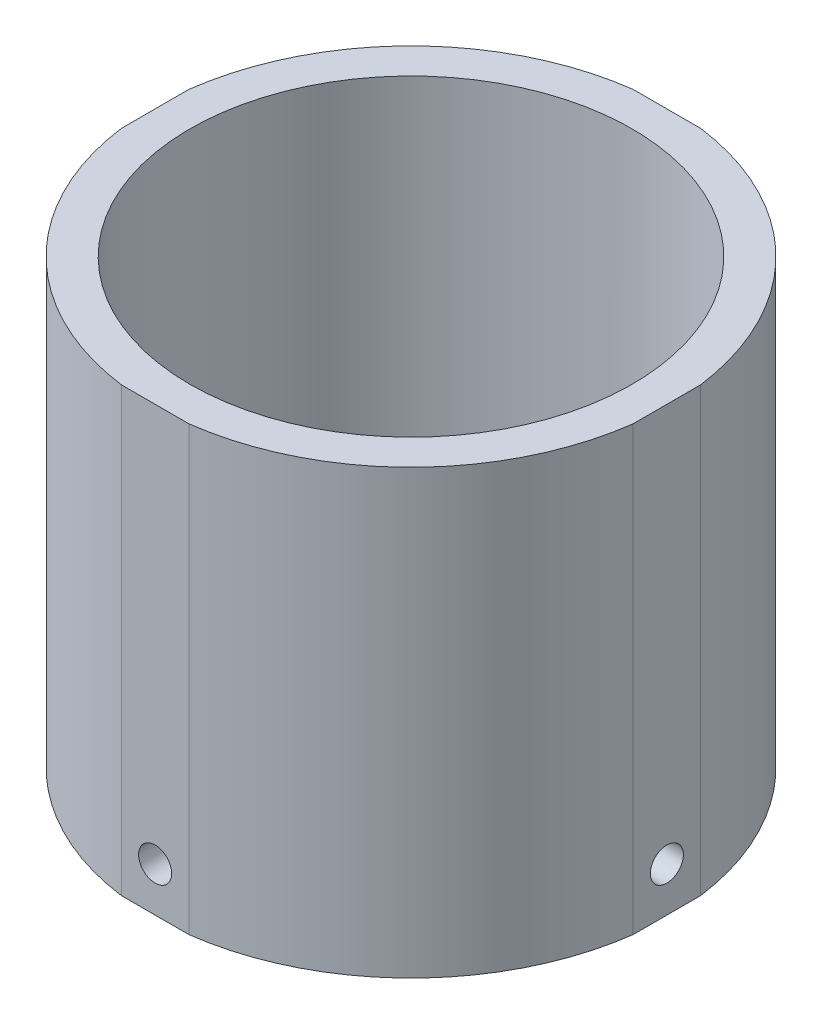
ISO-10303-21;
HEADER;
FILE_DESCRIPTION(('STEP AP214'),'2;1');
FILE_NAME('part.step','',(''),(''),'','','');
FILE_SCHEMA(('AUTOMOTIVE_DESIGN { 1 0 10303 214 1 1 1 1 }'));
ENDSEC;
DATA;
#1=APPLICATION_CONTEXT('core data for automotive mechanical design processes');
#2=APPLICATION_PROTOCOL_DEFINITION('international standard','automotive_design',2000,#1);
#3=PRODUCT_CONTEXT('',#1,'mechanical');
#4=PRODUCT('Part','Part','',(#3));
#5=PRODUCT_RELATED_PRODUCT_CATEGORY('part','',(#4));
#6=PRODUCT_DEFINITION_FORMATION('','',#4);
#7=PRODUCT_DEFINITION_CONTEXT('part definition',#1,'design');
#8=PRODUCT_DEFINITION('design','',#6,#7);
#9=PRODUCT_DEFINITION_SHAPE('','',#8);
#10=(LENGTH_UNIT() NAMED_UNIT(*) SI_UNIT(.MILLI.,.METRE.));
#11=(NAMED_UNIT(*) PLANE_ANGLE_UNIT() SI_UNIT($,.RADIAN.));
#12=(NAMED_UNIT(*) SI_UNIT($,.STERADIAN.) SOLID_ANGLE_UNIT());
#13=UNCERTAINTY_MEASURE_WITH_UNIT(LENGTH_MEASURE(1.E-05),#10,'distance_accuracy_value','');
#14=(GEOMETRIC_REPRESENTATION_CONTEXT(3) GLOBAL_UNCERTAINTY_ASSIGNED_CONTEXT((#13)) GLOBAL_UNIT_ASSIGNED_CONTEXT((#10,
#11,#12)) REPRESENTATION_CONTEXT('',''));
#15=CARTESIAN_POINT('',(0.,0.,0.));
#16=DIRECTION('',(0.,0.,1.));
#17=DIRECTION('',(1.,0.,0.));
#18=AXIS2_PLACEMENT_3D('',#15,#16,#17);
#19=CARTESIAN_POINT('',(0.,38.1,0.));
#20=DIRECTION('',(0.,-1.,0.));
#21=DIRECTION('',(0.,0.,-1.));
#22=AXIS2_PLACEMENT_3D('',#19,#20,#21);
#23=CYLINDRICAL_SURFACE('',#22,22.225);
#24=DIRECTION('',(0.,-1.,0.));
#25=VECTOR('',#24,1.);
#26=CARTESIAN_POINT('',(-22.0345,38.1,-2.90369329475415));
#27=LINE('',#26,#25);
#28=CARTESIAN_POINT('',(-22.0345,38.1,-2.90369329475415));
#29=VERTEX_POINT('',#28);
#30=CARTESIAN_POINT('',(-22.0345,0.,-2.90369329475415));
#31=VERTEX_POINT('',#30);
#32=EDGE_CURVE('E60',#29,#31,#27,.T.);
#33=ORIENTED_EDGE('',*,*,#32,.F.);
#34=CARTESIAN_POINT('',(0.,38.1,0.));
#35=DIRECTION('',(0.,1.,0.));
#36=DIRECTION('',(0.,0.,1.));
#37=AXIS2_PLACEMENT_3D('',#34,#35,#36);
#38=CIRCLE('',#37,22.225);
#39=CARTESIAN_POINT('',(-2.90369329475414,38.1,-22.0345));
#40=VERTEX_POINT('',#39);
#41=EDGE_CURVE('E251',#40,#29,#38,.T.);
#42=ORIENTED_EDGE('',*,*,#41,.F.);
#43=DIRECTION('',(0.,-1.,0.));
#44=VECTOR('',#43,1.);
#45=CARTESIAN_POINT('',(-2.90369329475414,38.1,-22.0345));
#46=LINE('',#45,#44);
#47=CARTESIAN_POINT('',(-2.90369329475414,0.,-22.0345));
#48=VERTEX_POINT('',#47);
#49=EDGE_CURVE('E189',#48,#40,#46,.F.);
#50=ORIENTED_EDGE('',*,*,#49,.F.);
#51=CARTESIAN_POINT('',(0.,0.,0.));
#52=DIRECTION('',(0.,1.,0.));
#53=DIRECTION('',(0.,0.,1.));
#54=AXIS2_PLACEMENT_3D('',#51,#52,#53);
#55=CIRCLE('',#54,22.225);
#56=EDGE_CURVE('E128',#48,#31,#55,.T.);
#57=ORIENTED_EDGE('',*,*,#56,.T.);
#58=EDGE_LOOP('',(#33,#42,#50,#57));
#59=FACE_BOUND('',#58,.T.);
#60=ADVANCED_FACE('F35',(#59),#23,.T.);
#61=DIRECTION('',(0.,-1.,0.));
#62=VECTOR('',#61,1.);
#63=CARTESIAN_POINT('',(-22.0345,38.1,2.90369329475415));
#64=LINE('',#63,#62);
#65=CARTESIAN_POINT('',(-22.0345,0.,2.90369329475415));
#66=VERTEX_POINT('',#65);
#67=CARTESIAN_POINT('',(-22.0345,38.1,2.90369329475415));
#68=VERTEX_POINT('',#67);
#69=EDGE_CURVE('E191',#66,#68,#64,.F.);
#70=ORIENTED_EDGE('',*,*,#69,.F.);
#71=CARTESIAN_POINT('',(-2.90369329475415,0.,22.0345));
#72=VERTEX_POINT('',#71);
#73=EDGE_CURVE('E130',#66,#72,#55,.T.);
#74=ORIENTED_EDGE('',*,*,#73,.T.);
#75=DIRECTION('',(0.,-1.,0.));
#76=VECTOR('',#75,1.);
#77=CARTESIAN_POINT('',(-2.90369329475415,38.1,22.0345));
#78=LINE('',#77,#76);
#79=CARTESIAN_POINT('',(-2.90369329475415,38.1,22.0345));
#80=VERTEX_POINT('',#79);
#81=EDGE_CURVE('E52',#80,#72,#78,.T.);
#82=ORIENTED_EDGE('',*,*,#81,.F.);
#83=EDGE_CURVE('E45',#68,#80,#38,.T.);
#84=ORIENTED_EDGE('',*,*,#83,.F.);
#85=EDGE_LOOP('',(#70,#74,#82,#84));
#86=FACE_BOUND('',#85,.T.);
#87=ADVANCED_FACE('F220',(#86),#23,.T.);
#88=DIRECTION('',(0.,-1.,0.));
#89=VECTOR('',#88,1.);
#90=CARTESIAN_POINT('',(2.90369329475414,38.1,22.0345));
#91=LINE('',#90,#89);
#92=CARTESIAN_POINT('',(2.90369329475414,0.,22.0345));
#93=VERTEX_POINT('',#92);
#94=CARTESIAN_POINT('',(2.90369329475414,38.1,22.0345));
#95=VERTEX_POINT('',#94);
#96=EDGE_CURVE('E202',#93,#95,#91,.F.);
#97=ORIENTED_EDGE('',*,*,#96,.F.);
#98=CARTESIAN_POINT('',(22.0345,0.,2.90369329475415));
#99=VERTEX_POINT('',#98);
#100=EDGE_CURVE('E127',#93,#99,#55,.T.);
#101=ORIENTED_EDGE('',*,*,#100,.T.);
#102=DIRECTION('',(0.,-1.,0.));
#103=VECTOR('',#102,1.);
#104=CARTESIAN_POINT('',(22.0345,38.1,2.90369329475415));
#105=LINE('',#104,#103);
#106=CARTESIAN_POINT('',(22.0345,38.1,2.90369329475415));
#107=VERTEX_POINT('',#106);
#108=EDGE_CURVE('E107',#107,#99,#105,.T.);
#109=ORIENTED_EDGE('',*,*,#108,.F.);
#110=EDGE_CURVE('E11',#95,#107,#38,.T.);
#111=ORIENTED_EDGE('',*,*,#110,.F.);
#112=EDGE_LOOP('',(#97,#101,#109,#111));
#113=FACE_BOUND('',#112,.T.);
#114=ADVANCED_FACE('F226',(#113),#23,.T.);
#115=DIRECTION('',(0.,-1.,0.));
#116=VECTOR('',#115,1.);
#117=CARTESIAN_POINT('',(22.0345,38.1,-2.90369329475415));
#118=LINE('',#117,#116);
#119=CARTESIAN_POINT('',(22.0345,0.,-2.90369329475415));
#120=VERTEX_POINT('',#119);
#121=CARTESIAN_POINT('',(22.0345,38.1,-2.90369329475415));
#122=VERTEX_POINT('',#121);
#123=EDGE_CURVE('E104',#120,#122,#118,.F.);
#124=ORIENTED_EDGE('',*,*,#123,.F.);
#125=CARTESIAN_POINT('',(2.90369329475415,0.,-22.0345));
#126=VERTEX_POINT('',#125);
#127=EDGE_CURVE('E120',#120,#126,#55,.T.);
#128=ORIENTED_EDGE('',*,*,#127,.T.);
#129=DIRECTION('',(0.,-1.,0.));
#130=VECTOR('',#129,1.);
#131=CARTESIAN_POINT('',(2.90369329475415,38.1,-22.0345));
#132=LINE('',#131,#130);
#133=CARTESIAN_POINT('',(2.90369329475415,38.1,-22.0345));
#134=VERTEX_POINT('',#133);
#135=EDGE_CURVE('E197',#134,#126,#132,.T.);
#136=ORIENTED_EDGE('',*,*,#135,.F.);
#137=EDGE_CURVE('E43',#122,#134,#38,.T.);
#138=ORIENTED_EDGE('',*,*,#137,.F.);
#139=EDGE_LOOP('',(#124,#128,#136,#138));
#140=FACE_BOUND('',#139,.T.);
#141=ADVANCED_FACE('F118',(#140),#23,.T.);
#142=CARTESIAN_POINT('',(0.,38.1,0.));
#143=DIRECTION('',(0.,1.,0.));
#144=DIRECTION('',(0.,0.,1.));
#145=AXIS2_PLACEMENT_3D('',#142,#143,#144);
#146=PLANE('',#145);
#147=CARTESIAN_POINT('',(0.,38.1,0.));
#148=DIRECTION('',(0.,1.,0.));
#149=DIRECTION('',(0.,0.,1.));
#150=AXIS2_PLACEMENT_3D('',#147,#148,#149);
#151=CIRCLE('',#150,19.05);
#152=CARTESIAN_POINT('',(0.,38.1,19.05));
#153=VERTEX_POINT('',#152);
#154=EDGE_CURVE('E205',#153,#153,#151,.T.);
#155=ORIENTED_EDGE('',*,*,#154,.F.);
#156=EDGE_LOOP('',(#155));
#157=FACE_BOUND('',#156,.T.);
#158=ORIENTED_EDGE('',*,*,#41,.T.);
#159=DIRECTION('',(0.,0.,1.));
#160=VECTOR('',#159,1.);
#161=CARTESIAN_POINT('',(-22.0345,38.1,0.));
#162=LINE('',#161,#160);
#163=EDGE_CURVE('E182',#29,#68,#162,.T.);
#164=ORIENTED_EDGE('',*,*,#163,.T.);
#165=ORIENTED_EDGE('',*,*,#83,.T.);
#166=DIRECTION('',(1.,0.,0.));
#167=VECTOR('',#166,1.);
#168=CARTESIAN_POINT('',(0.,38.1,22.0345));
#169=LINE('',#168,#167);
#170=EDGE_CURVE('E199',#80,#95,#169,.T.);
#171=ORIENTED_EDGE('',*,*,#170,.T.);
#172=ORIENTED_EDGE('',*,*,#110,.T.);
#173=DIRECTION('',(0.,0.,-1.));
#174=VECTOR('',#173,1.);
#175=CARTESIAN_POINT('',(22.0345,38.1,0.));
#176=LINE('',#175,#174);
#177=EDGE_CURVE('E122',#107,#122,#176,.T.);
#178=ORIENTED_EDGE('',*,*,#177,.T.);
#179=ORIENTED_EDGE('',*,*,#137,.T.);
#180=DIRECTION('',(-1.,0.,0.));
#181=VECTOR('',#180,1.);
#182=CARTESIAN_POINT('',(0.,38.1,-22.0345));
#183=LINE('',#182,#181);
#184=EDGE_CURVE('E185',#134,#40,#183,.T.);
#185=ORIENTED_EDGE('',*,*,#184,.T.);
#186=EDGE_LOOP('',(#158,#164,#165,#171,#172,#178,#179,#185));
#187=FACE_BOUND('',#186,.T.);
#188=ADVANCED_FACE('F229',(#157,#187),#146,.T.);
#189=CARTESIAN_POINT('',(0.,0.,0.));
#190=DIRECTION('',(0.,1.,0.));
#191=DIRECTION('',(0.,0.,1.));
#192=AXIS2_PLACEMENT_3D('',#189,#190,#191);
#193=PLANE('',#192);
#194=CARTESIAN_POINT('',(0.,0.,0.));
#195=DIRECTION('',(0.,1.,0.));
#196=DIRECTION('',(0.,0.,1.));
#197=AXIS2_PLACEMENT_3D('',#194,#195,#196);
#198=CIRCLE('',#197,19.05);
#199=CARTESIAN_POINT('',(0.,0.,19.05));
#200=VERTEX_POINT('',#199);
#201=EDGE_CURVE('E207',#200,#200,#198,.T.);
#202=ORIENTED_EDGE('',*,*,#201,.T.);
#203=EDGE_LOOP('',(#202));
#204=FACE_BOUND('',#203,.T.);
#205=DIRECTION('',(0.,0.,-1.));
#206=VECTOR('',#205,1.);
#207=CARTESIAN_POINT('',(-22.0345,0.,-22.0345));
#208=LINE('',#207,#206);
#209=EDGE_CURVE('E247',#66,#31,#208,.T.);
#210=ORIENTED_EDGE('',*,*,#209,.T.);
#211=ORIENTED_EDGE('',*,*,#56,.F.);
#212=DIRECTION('',(1.,0.,0.));
#213=VECTOR('',#212,1.);
#214=CARTESIAN_POINT('',(22.0345,0.,-22.0345));
#215=LINE('',#214,#213);
#216=EDGE_CURVE('E113',#48,#126,#215,.T.);
#217=ORIENTED_EDGE('',*,*,#216,.T.);
#218=ORIENTED_EDGE('',*,*,#127,.F.);
#219=DIRECTION('',(0.,0.,1.));
#220=VECTOR('',#219,1.);
#221=CARTESIAN_POINT('',(22.0345,0.,-22.0345));
#222=LINE('',#221,#220);
#223=EDGE_CURVE('E101',#120,#99,#222,.T.);
#224=ORIENTED_EDGE('',*,*,#223,.T.);
#225=ORIENTED_EDGE('',*,*,#100,.F.);
#226=DIRECTION('',(-1.,0.,0.));
#227=VECTOR('',#226,1.);
#228=CARTESIAN_POINT('',(22.0345,0.,22.0345));
#229=LINE('',#228,#227);
#230=EDGE_CURVE('E112',#93,#72,#229,.T.);
#231=ORIENTED_EDGE('',*,*,#230,.T.);
#232=ORIENTED_EDGE('',*,*,#73,.F.);
#233=EDGE_LOOP('',(#210,#211,#217,#218,#224,#225,#231,#232));
#234=FACE_BOUND('',#233,.T.);
#235=ADVANCED_FACE('F125',(#204,#234),#193,.F.);
#236=CARTESIAN_POINT('',(0.,3.81,43.18));
#237=DIRECTION('',(0.,0.,-1.));
#238=DIRECTION('',(-1.,0.,0.));
#239=AXIS2_PLACEMENT_3D('',#236,#237,#238);
#240=CYLINDRICAL_SURFACE('',#239,1.4224);
#241=CARTESIAN_POINT('',(-1.4224,3.81,18.9968228459393));
#242=CARTESIAN_POINT('',(-1.42239650312585,3.73022273924507,18.9968235536411));
#243=CARTESIAN_POINT('',(-1.41566580574166,3.65039046873682,18.997330790991));
#244=CARTESIAN_POINT('',(-1.38891372026636,3.49293275805348,18.9993050301946));
#245=CARTESIAN_POINT('',(-1.3688770877627,3.41530995573329,19.0007731328695));
#246=CARTESIAN_POINT('',(-1.31609405220517,3.26457461392117,19.0045018954982));
#247=CARTESIAN_POINT('',(-1.28335463079194,3.19145962240734,19.0067621200242));
#248=CARTESIAN_POINT('',(-1.20610729852203,3.05178101507184,19.0118199064864));
#249=CARTESIAN_POINT('',(-1.16160198406864,2.98521595830439,19.0146173498363));
#250=CARTESIAN_POINT('',(-1.06198533150722,2.86036962832696,19.0204409442066));
#251=CARTESIAN_POINT('',(-1.00685454848239,2.80210388840473,19.023467508262));
#252=CARTESIAN_POINT('',(-0.88759272190058,2.69564339814147,19.0294045192855));
#253=CARTESIAN_POINT('',(-0.823461293430098,2.64744907872523,19.0323149612807));
#254=CARTESIAN_POINT('',(-0.68792781198772,2.56244925949874,19.0376955845796));
#255=CARTESIAN_POINT('',(-0.616517444720699,2.52565698174369,19.0401652533567));
#256=CARTESIAN_POINT('',(-0.468511292960148,2.46459023930297,19.0443816474513));
#257=CARTESIAN_POINT('',(-0.391915583333817,2.44031559392836,19.0461283832041));
#258=CARTESIAN_POINT('',(-0.235865836215338,2.40501729955453,19.0486992253169));
#259=CARTESIAN_POINT('',(-0.156417446766327,2.39396880914196,19.0495250611141));
#260=CARTESIAN_POINT('',(0.00321015355501787,2.38535969184375,19.0501668999158));
#261=CARTESIAN_POINT('',(0.0833893532276772,2.38779885860542,19.0499829183699));
#262=CARTESIAN_POINT('',(0.242034224887461,2.40607542595008,19.0486272860917));
#263=CARTESIAN_POINT('',(0.320502993830796,2.4218861105936,19.0474576047782));
#264=CARTESIAN_POINT('',(0.473669792392412,2.46641540208669,19.0442644564052));
#265=CARTESIAN_POINT('',(0.548367792182319,2.49513411102639,19.0422409825931));
#266=CARTESIAN_POINT('',(0.691958007414708,2.5646942233799,19.0375645831906));
#267=CARTESIAN_POINT('',(0.760844374441333,2.60554765579722,19.0349110335396));
#268=CARTESIAN_POINT('',(0.890792047433247,2.69820879700301,19.0292728816993));
#269=CARTESIAN_POINT('',(0.951853226464974,2.75001668344923,19.0262882741413));
#270=CARTESIAN_POINT('',(1.06457330212404,2.86326681139214,19.0203150448229));
#271=CARTESIAN_POINT('',(1.11620889028095,2.92473225552859,19.0173264310408));
#272=CARTESIAN_POINT('',(1.20843212907746,3.05547166839475,19.0116893876373));
#273=CARTESIAN_POINT('',(1.24901977299793,3.1247456418734,19.0090409582229));
#274=CARTESIAN_POINT('',(1.31799375459469,3.26915134892105,19.0043835330049));
#275=CARTESIAN_POINT('',(1.34637898541885,3.34428361315186,19.0023745952124));
#276=CARTESIAN_POINT('',(1.39012565808671,3.49826582502389,18.9992246125286));
#277=CARTESIAN_POINT('',(1.40548731917611,3.5771157100571,18.9980835530271));
#278=CARTESIAN_POINT('',(1.42272149554034,3.73609123704091,18.9968007722778));
#279=CARTESIAN_POINT('',(1.42462646795165,3.816213341818,18.9966566464729));
#280=CARTESIAN_POINT('',(1.41497811467307,3.97563791461554,18.9973776987401));
#281=CARTESIAN_POINT('',(1.4034248894368,4.05494038874936,18.9982428692787));
#282=CARTESIAN_POINT('',(1.3672151092252,4.2103820467897,19.0008828312764));
#283=CARTESIAN_POINT('',(1.34257361163936,4.28652475753611,19.0026565773825));
#284=CARTESIAN_POINT('',(1.28090204937565,4.43359455238775,19.0069129474634));
#285=CARTESIAN_POINT('',(1.24387182463275,4.50452156909064,19.0093955805972));
#286=CARTESIAN_POINT('',(1.15839146344258,4.63929540088432,19.0147958121849));
#287=CARTESIAN_POINT('',(1.10991964439786,4.70312843035462,19.017714232579));
#288=CARTESIAN_POINT('',(1.00296345499899,4.82176318028565,19.0236543681025));
#289=CARTESIAN_POINT('',(0.944478945937115,4.87656477561155,19.0266760846623));
#290=CARTESIAN_POINT('',(0.819017532224621,4.97569131096355,19.0324894363662));
#291=CARTESIAN_POINT('',(0.752023971353937,5.01999520101865,19.0352806020349));
#292=CARTESIAN_POINT('',(0.611529485818923,5.09672444872868,19.040311605726));
#293=CARTESIAN_POINT('',(0.538028615078287,5.1291499048044,19.0425514483163));
#294=CARTESIAN_POINT('',(0.386682238301695,5.1811654827618,19.0462252431642));
#295=CARTESIAN_POINT('',(0.308841273994902,5.20076875876537,19.0476600211123));
#296=CARTESIAN_POINT('',(0.150961659156019,5.2266265291612,19.0495653537497));
#297=CARTESIAN_POINT('',(0.0709230412278487,5.23288122148192,19.0500359227359));
#298=CARTESIAN_POINT('',(-0.0888720193142848,5.23186216085532,19.049959849835));
#299=CARTESIAN_POINT('',(-0.168628674768436,5.2246212735851,19.0494156791337));
#300=CARTESIAN_POINT('',(-0.325790053209727,5.19688495725299,19.0473761821465));
#301=CARTESIAN_POINT('',(-0.403194772527937,5.17638950751559,19.045880854377));
#302=CARTESIAN_POINT('',(-0.553458356750883,5.12273382488936,19.0421069474212));
#303=CARTESIAN_POINT('',(-0.626317366082753,5.08957399461418,19.0398283931348));
#304=CARTESIAN_POINT('',(-0.76543904648064,5.01153485589771,19.0347433587709));
#305=CARTESIAN_POINT('',(-0.831701851748918,4.96665578595611,19.0319368894373));
#306=CARTESIAN_POINT('',(-0.955917943819801,4.86632919853382,19.0261032009382));
#307=CARTESIAN_POINT('',(-1.01385169954591,4.8108575284597,19.0230754872381));
#308=CARTESIAN_POINT('',(-1.11960745030558,4.69096050095371,19.0171447021945));
#309=CARTESIAN_POINT('',(-1.16742698183218,4.62653296847353,19.0142416613543));
#310=CARTESIAN_POINT('',(-1.25164817605946,4.49045148196051,19.0088838730331));
#311=CARTESIAN_POINT('',(-1.28803162664287,4.41878623914607,19.0064298431791));
#312=CARTESIAN_POINT('',(-1.34820360833026,4.27039608886235,19.0022568457678));
#313=CARTESIAN_POINT('',(-1.37200674217858,4.1936771644131,19.0005370264153));
#314=CARTESIAN_POINT('',(-1.40022383808304,4.06541493108162,18.9984732883963));
#315=CARTESIAN_POINT('',(-1.40852898067266,4.01469850399186,18.9978571816173));
#316=CARTESIAN_POINT('',(-1.41961818114007,3.91266231187558,18.9970317330825));
#317=CARTESIAN_POINT('',(-1.42240225049629,3.86134254810363,18.996822390481));
#318=CARTESIAN_POINT('',(-1.4224,3.81,18.9968228459393));
#319=B_SPLINE_CURVE_WITH_KNOTS('',3,(#241,#242,#243,#244,#245,#246,#247,#248,#249,#250,#251,
#252,#253,#254,#255,#256,#257,#258,#259,#260,#261,#262,#263,#264,#265,#266,#267,#268,#269,#270,
#271,#272,#273,#274,#275,#276,#277,#278,#279,#280,#281,#282,#283,#284,#285,#286,#287,#288,#289,
#290,#291,#292,#293,#294,#295,#296,#297,#298,#299,#300,#301,#302,#303,#304,#305,#306,#307,#308,
#309,#310,#311,#312,#313,#314,#315,#316,#317,#318),.UNSPECIFIED.,.T.,.F.,(4,2,2,2,2,2,2,2,2,2,2,
2,2,2,2,2,2,2,2,2,2,2,2,2,2,2,2,2,2,2,2,2,2,2,2,2,2,2,4),(0.,0.239144334368397,0.47856312662972,
0.717850516758195,0.957085146869091,1.19676181327656,1.43644873260565,1.67641256694454,
1.9163729373675,2.1558819026414,2.39538720358883,2.63441510668367,2.87344490029386,
3.11271243652183,3.35198385345371,3.59183917570764,3.83169464383615,4.07157186410008,
4.31144504606277,4.55073946281706,4.79003209346005,5.02905002453012,5.26807104388288,
5.50754871324966,5.74702970041521,5.98698690558222,6.22694212249777,6.46665078449958,
6.70635589215447,6.94547801048555,7.18460050181894,7.42371539183549,7.6628254159746,
7.90248729869244,8.14220748845656,8.38230752411245,8.62212824542763,8.77603557317642,
8.92994258094821),.UNSPECIFIED.);
#320=CARTESIAN_POINT('',(-1.4224,3.81,18.9968228459393));
#321=VERTEX_POINT('',#320);
#322=EDGE_CURVE('E134',#321,#321,#319,.T.);
#323=ORIENTED_EDGE('',*,*,#322,.F.);
#324=EDGE_LOOP('',(#323));
#325=FACE_BOUND('',#324,.T.);
#326=CARTESIAN_POINT('',(0.,3.81,22.0345));
#327=DIRECTION('',(0.,0.,1.));
#328=DIRECTION('',(1.,0.,0.));
#329=AXIS2_PLACEMENT_3D('',#326,#327,#328);
#330=CIRCLE('',#329,1.4224);
#331=CARTESIAN_POINT('',(1.4224,3.81,22.0345));
#332=VERTEX_POINT('',#331);
#333=EDGE_CURVE('E38',#332,#332,#330,.T.);
#334=ORIENTED_EDGE('',*,*,#333,.T.);
#335=EDGE_LOOP('',(#334));
#336=FACE_BOUND('',#335,.T.);
#337=ADVANCED_FACE('F151',(#325,#336),#240,.F.);
#338=CARTESIAN_POINT('',(0.,5.23240000000001,-19.05));
#339=CARTESIAN_POINT('',(0.0797776102977973,5.23239650344165,-19.0499992996025));
#340=CARTESIAN_POINT('',(0.159610229195425,5.2256657490711,-19.0494935107939));
#341=CARTESIAN_POINT('',(0.317068663767573,5.19891341665385,-19.0475244469723));
#342=CARTESIAN_POINT('',(0.394691841860264,5.17887659538863,-19.0460600738479));
#343=CARTESIAN_POINT('',(0.545427978095503,5.12609300759627,-19.0423394032213));
#344=CARTESIAN_POINT('',(0.618543385077416,5.09335321371694,-19.040083540232));
#345=CARTESIAN_POINT('',(0.758222687964014,5.01610500443307,-19.0350332051851));
#346=CARTESIAN_POINT('',(0.824788025337361,4.97159918635213,-19.0322388520349));
#347=CARTESIAN_POINT('',(0.949634036048403,4.87198202605982,-19.0264188540203));
#348=CARTESIAN_POINT('',(1.0078992655522,4.81685135134978,-19.0233927936957));
#349=CARTESIAN_POINT('',(1.11435877139131,4.6975899553822,-19.0174539480976));
#350=CARTESIAN_POINT('',(1.16255261523735,4.63345884782223,-19.014541167693));
#351=CARTESIAN_POINT('',(1.24755193904236,4.49792564515841,-19.0091540243329));
#352=CARTESIAN_POINT('',(1.2843441090786,4.42651518059441,-19.0066801751993));
#353=CARTESIAN_POINT('',(1.34541062549407,4.27850881729636,-19.0024554377495));
#354=CARTESIAN_POINT('',(1.36968515385518,4.20191299396554,-19.0007045389233));
#355=CARTESIAN_POINT('',(1.40498320092678,4.04586290846994,-18.9981272261391));
#356=CARTESIAN_POINT('',(1.41603155176928,3.96641429233215,-18.9972990799175));
#357=CARTESIAN_POINT('',(1.42464031139577,3.80678624888005,-18.996655483633));
#358=CARTESIAN_POINT('',(1.42220092802153,3.72660683284616,-18.9968400179651));
#359=CARTESIAN_POINT('',(1.40392401979004,3.56796292201519,-18.9981993659829));
#360=CARTESIAN_POINT('',(1.38811342886137,3.48949530480235,-18.9993721889192));
#361=CARTESIAN_POINT('',(1.34358472482626,3.33633076138848,-19.0025728298076));
#362=CARTESIAN_POINT('',(1.31486650752876,3.26163386563032,-19.0046006546612));
#363=CARTESIAN_POINT('',(1.24530740889355,3.11804498069661,-19.0092850912956));
#364=CARTESIAN_POINT('',(1.20445438313874,3.04915889603411,-19.0119423324489));
#365=CARTESIAN_POINT('',(1.11179410759826,2.91921161489586,-19.0175855759387));
#366=CARTESIAN_POINT('',(1.05998668038842,2.85815054518456,-19.0205715835999));
#367=CARTESIAN_POINT('',(0.946736875637851,2.74542994309306,-19.0265447401275));
#368=CARTESIAN_POINT('',(0.885271202350259,2.69379381212826,-19.0295318738649));
#369=CARTESIAN_POINT('',(0.75453113853296,2.60156958770516,-19.0351636888983));
#370=CARTESIAN_POINT('',(0.685256744034189,2.56098149986247,-19.0378083700203));
#371=CARTESIAN_POINT('',(0.540850928367932,2.49200719987137,-19.0424576476264));
#372=CARTESIAN_POINT('',(0.465719042718157,2.46362195653859,-19.0444621932853));
#373=CARTESIAN_POINT('',(0.311737652923509,2.41987514260234,-19.0476047116139));
#374=CARTESIAN_POINT('',(0.232888210739304,2.40451335501732,-19.0487426987213));
#375=CARTESIAN_POINT('',(0.0739128811028659,2.38727870235924,-19.050022020537));
#376=CARTESIAN_POINT('',(-0.00620948222288296,2.38537349979674,-19.0501657445397));
#377=CARTESIAN_POINT('',(-0.16563462760175,2.39502148507885,-19.0494467154571));
#378=CARTESIAN_POINT('',(-0.244937415768394,2.40657457245971,-19.048583969885));
#379=CARTESIAN_POINT('',(-0.400380592011559,2.44278439761849,-19.0459506075099));
#380=CARTESIAN_POINT('',(-0.476524474700092,2.46742621507946,-19.0441810245244));
#381=CARTESIAN_POINT('',(-0.623596471685354,2.52909881013435,-19.0399329064162));
#382=CARTESIAN_POINT('',(-0.694524519370452,2.56612974591668,-19.0374543622412));
#383=CARTESIAN_POINT('',(-0.829299040293256,2.65161114610796,-19.0320604994051));
#384=CARTESIAN_POINT('',(-0.893131842658083,2.70008311230415,-19.0291443621555));
#385=CARTESIAN_POINT('',(-1.01176606570811,2.80703946609593,-19.0232059458456));
#386=CARTESIAN_POINT('',(-1.06656736027875,2.8655239934821,-19.0201836653039));
#387=CARTESIAN_POINT('',(-1.16569326471478,2.99098527315935,-19.0143665823523));
#388=CARTESIAN_POINT('',(-1.20999682762284,3.05797867895925,-19.0115722441744));
#389=CARTESIAN_POINT('',(-1.28672550095445,3.19847276892166,-19.006533674207));
#390=CARTESIAN_POINT('',(-1.31915070974781,3.27197339918876,-19.0042894378618));
#391=CARTESIAN_POINT('',(-1.37116611995007,3.42331994317834,-19.0006075537979));
#392=CARTESIAN_POINT('',(-1.3907693684208,3.50116135208257,-18.9991690863791));
#393=CARTESIAN_POINT('',(-1.41662693303293,3.65904190305009,-18.9972587196332));
#394=CARTESIAN_POINT('',(-1.42288144946539,3.73908101211973,-18.9967868058036));
#395=CARTESIAN_POINT('',(-1.42186188379648,3.89887575558881,-18.9968631290124));
#396=CARTESIAN_POINT('',(-1.41462087797622,3.97863160431764,-18.9974088718699));
#397=CARTESIAN_POINT('',(-1.38688460871371,4.13579134018077,-18.9994537225224));
#398=CARTESIAN_POINT('',(-1.36638932315851,4.2131952233909,-19.0009528319079));
#399=CARTESIAN_POINT('',(-1.31273427545313,4.36345716037119,-19.0047348574851));
#400=CARTESIAN_POINT('',(-1.27957491939162,4.43631535981703,-19.0070177485437));
#401=CARTESIAN_POINT('',(-1.20153697917857,4.5754356189048,-19.0121101183255));
#402=CARTESIAN_POINT('',(-1.15665863264064,4.64169781224937,-19.0149195863716));
#403=CARTESIAN_POINT('',(-1.05633283188317,4.76591396145729,-19.0207566762978));
#404=CARTESIAN_POINT('',(-1.00086106025747,4.82384825343581,-19.0237847899377));
#405=CARTESIAN_POINT('',(-0.880963610262611,4.9296050386078,-19.0297135499757));
#406=CARTESIAN_POINT('',(-0.816535758025097,4.97742506968591,-19.0326141652011));
#407=CARTESIAN_POINT('',(-0.68045402007755,5.06164679126,-19.0379653103692));
#408=CARTESIAN_POINT('',(-0.608788902777783,5.0980303621002,-19.0404151235517));
#409=CARTESIAN_POINT('',(-0.460399020525028,5.15820260357175,-19.0445797857154));
#410=CARTESIAN_POINT('',(-0.383680237841386,5.18200587517572,-19.0462954862814));
#411=CARTESIAN_POINT('',(-0.255417634806845,5.21022336600367,-19.0483540207198));
#412=CARTESIAN_POINT('',(-0.204700668313197,5.21852868620165,-19.0489684832203));
#413=CARTESIAN_POINT('',(-0.102663395096278,5.22961812266886,-19.0497916978228));
#414=CARTESIAN_POINT('',(-0.0513430896155781,5.23240225030694,-19.0500004507602));
#415=CARTESIAN_POINT('',(0.,5.23240000000001,-19.05));
#416=B_SPLINE_CURVE_WITH_KNOTS('',3,(#338,#339,#340,#341,#342,#343,#344,#345,#346,#347,#348,
#349,#350,#351,#352,#353,#354,#355,#356,#357,#358,#359,#360,#361,#362,#363,#364,#365,#366,#367,
#368,#369,#370,#371,#372,#373,#374,#375,#376,#377,#378,#379,#380,#381,#382,#383,#384,#385,#386,
#387,#388,#389,#390,#391,#392,#393,#394,#395,#396,#397,#398,#399,#400,#401,#402,#403,#404,#405,
#406,#407,#408,#409,#410,#411,#412,#413,#414,#415),.UNSPECIFIED.,.T.,.F.,(4,2,2,2,2,2,2,2,2,2,2,
2,2,2,2,2,2,2,2,2,2,2,2,2,2,2,2,2,2,2,2,2,2,2,2,2,2,2,4),(0.,0.239145384208391,
0.478565203257491,0.717853790521692,0.957089599406767,1.19676489223495,1.43645047517676,
1.6764148139112,1.91637566393787,2.15588527761687,2.39539120053764,2.63441582714596,
2.87344238320877,3.11270896573394,3.35197942386392,3.59183612248475,3.83169294302192,
4.07156880290202,4.31144066617359,4.55073589717607,4.79002934189349,5.02905059093687,
5.26807489199997,5.50755203305921,5.7470325178565,5.98698915088914,6.22694379669151,
6.4666538937869,6.70636039412685,6.94548016836871,7.18460034154981,7.42371284769811,
7.66282050599053,7.90248378555526,8.14220533939509,8.38230480995929,8.62212500041008,
8.77603394967214,8.9299425820156),.UNSPECIFIED.);
#417=CARTESIAN_POINT('',(0.,5.23240000000001,-19.05));
#418=VERTEX_POINT('',#417);
#419=EDGE_CURVE('E142',#418,#418,#416,.T.);
#420=ORIENTED_EDGE('',*,*,#419,.F.);
#421=EDGE_LOOP('',(#420));
#422=FACE_BOUND('',#421,.T.);
#423=CARTESIAN_POINT('',(0.,3.81,-22.0345));
#424=DIRECTION('',(0.,0.,-1.));
#425=DIRECTION('',(-1.,0.,0.));
#426=AXIS2_PLACEMENT_3D('',#423,#424,#425);
#427=CIRCLE('',#426,1.4224);
#428=CARTESIAN_POINT('',(-1.4224,3.81,-22.0345));
#429=VERTEX_POINT('',#428);
#430=EDGE_CURVE('E183',#429,#429,#427,.T.);
#431=ORIENTED_EDGE('',*,*,#430,.T.);
#432=EDGE_LOOP('',(#431));
#433=FACE_BOUND('',#432,.T.);
#434=ADVANCED_FACE('F155',(#422,#433),#240,.F.);
#435=CARTESIAN_POINT('',(43.18,3.81,0.));
#436=DIRECTION('',(-1.,0.,0.));
#437=DIRECTION('',(0.,0.,1.));
#438=AXIS2_PLACEMENT_3D('',#435,#436,#437);
#439=CYLINDRICAL_SURFACE('',#438,1.4224);
#440=CARTESIAN_POINT('',(-18.9968228459393,3.81,1.4224));
#441=CARTESIAN_POINT('',(-18.9968235536411,3.88977726075493,1.42239650312585));
#442=CARTESIAN_POINT('',(-18.997330790991,3.96960953126318,1.41566580574166));
#443=CARTESIAN_POINT('',(-18.9993050301946,4.12706724194652,1.38891372026636));
#444=CARTESIAN_POINT('',(-19.0007731328695,4.20469004426671,1.3688770877627));
#445=CARTESIAN_POINT('',(-19.0045018954982,4.35542538607883,1.31609405220517));
#446=CARTESIAN_POINT('',(-19.0067621200242,4.42854037759266,1.28335463079194));
#447=CARTESIAN_POINT('',(-19.0118199064864,4.56821898492816,1.20610729852203));
#448=CARTESIAN_POINT('',(-19.0146173498363,4.63478404169561,1.16160198406864));
#449=CARTESIAN_POINT('',(-19.0204409442066,4.75963037167304,1.06198533150722));
#450=CARTESIAN_POINT('',(-19.023467508262,4.81789611159526,1.00685454848239));
#451=CARTESIAN_POINT('',(-19.0294045192855,4.92435660185853,0.88759272190058));
#452=CARTESIAN_POINT('',(-19.0323149612807,4.97255092127477,0.823461293430097));
#453=CARTESIAN_POINT('',(-19.0376955845796,5.05755074050125,0.68792781198772));
#454=CARTESIAN_POINT('',(-19.0401652533567,5.09434301825631,0.616517444720698));
#455=CARTESIAN_POINT('',(-19.0443816474513,5.15540976069703,0.468511292960147));
#456=CARTESIAN_POINT('',(-19.0461283832041,5.17968440607164,0.391915583333816));
#457=CARTESIAN_POINT('',(-19.0486992253169,5.21498270044547,0.235865836215338));
#458=CARTESIAN_POINT('',(-19.0495250611141,5.22603119085804,0.156417446766326));
#459=CARTESIAN_POINT('',(-19.0501668999158,5.23464030815625,-0.00321015355501875));
#460=CARTESIAN_POINT('',(-19.0499829183699,5.23220114139457,-0.083389353227678));
#461=CARTESIAN_POINT('',(-19.0486272860917,5.21392457404992,-0.242034224887462));
#462=CARTESIAN_POINT('',(-19.0474576047782,5.1981138894064,-0.320502993830797));
#463=CARTESIAN_POINT('',(-19.0442644564052,5.15358459791331,-0.473669792392413));
#464=CARTESIAN_POINT('',(-19.0422409825931,5.12486588897361,-0.548367792182319));
#465=CARTESIAN_POINT('',(-19.0375645831906,5.0553057766201,-0.691958007414708));
#466=CARTESIAN_POINT('',(-19.0349110335396,5.01445234420278,-0.760844374441333));
#467=CARTESIAN_POINT('',(-19.0292728816993,4.92179120299699,-0.890792047433248));
#468=CARTESIAN_POINT('',(-19.0262882741413,4.86998331655077,-0.951853226464975));
#469=CARTESIAN_POINT('',(-19.0203150448229,4.75673318860785,-1.06457330212404));
#470=CARTESIAN_POINT('',(-19.0173264310408,4.6952677444714,-1.11620889028095));
#471=CARTESIAN_POINT('',(-19.0116893876373,4.56452833160525,-1.20843212907746));
#472=CARTESIAN_POINT('',(-19.0090409582229,4.4952543581266,-1.24901977299793));
#473=CARTESIAN_POINT('',(-19.0043835330049,4.35084865107895,-1.31799375459469));
#474=CARTESIAN_POINT('',(-19.0023745952124,4.27571638684813,-1.34637898541885));
#475=CARTESIAN_POINT('',(-18.9992246125286,4.12173417497611,-1.39012565808671));
#476=CARTESIAN_POINT('',(-18.9980835530271,4.0428842899429,-1.40548731917611));
#477=CARTESIAN_POINT('',(-18.9968007722778,3.88390876295908,-1.42272149554034));
#478=CARTESIAN_POINT('',(-18.9966566464729,3.803786658182,-1.42462646795165));
#479=CARTESIAN_POINT('',(-18.9973776987401,3.64436208538446,-1.41497811467307));
#480=CARTESIAN_POINT('',(-18.9982428692787,3.56505961125064,-1.4034248894368));
#481=CARTESIAN_POINT('',(-19.0008828312764,3.4096179532103,-1.3672151092252));
#482=CARTESIAN_POINT('',(-19.0026565773825,3.33347524246389,-1.34257361163935));
#483=CARTESIAN_POINT('',(-19.0069129474634,3.18640544761225,-1.28090204937565));
#484=CARTESIAN_POINT('',(-19.0093955805972,3.11547843090935,-1.24387182463275));
#485=CARTESIAN_POINT('',(-19.0147958121849,2.98070459911568,-1.15839146344258));
#486=CARTESIAN_POINT('',(-19.017714232579,2.91687156964538,-1.10991964439786));
#487=CARTESIAN_POINT('',(-19.0236543681025,2.79823681971435,-1.00296345499899));
#488=CARTESIAN_POINT('',(-19.0266760846623,2.74343522438845,-0.944478945937114));
#489=CARTESIAN_POINT('',(-19.0324894363662,2.64430868903644,-0.819017532224619));
#490=CARTESIAN_POINT('',(-19.0352806020349,2.60000479898134,-0.752023971353936));
#491=CARTESIAN_POINT('',(-19.040311605726,2.52327555127132,-0.611529485818921));
#492=CARTESIAN_POINT('',(-19.0425514483163,2.49085009519559,-0.538028615078286));
#493=CARTESIAN_POINT('',(-19.0462252431642,2.4388345172382,-0.386682238301694));
#494=CARTESIAN_POINT('',(-19.0476600211123,2.41923124123462,-0.3088412739949));
#495=CARTESIAN_POINT('',(-19.0495653537497,2.3933734708388,-0.150961659156018));
#496=CARTESIAN_POINT('',(-19.0500359227359,2.38711877851808,-0.070923041227847));
#497=CARTESIAN_POINT('',(-19.049959849835,2.38813783914468,0.0888720193142865));
#498=CARTESIAN_POINT('',(-19.0494156791337,2.39537872641489,0.168628674768437));
#499=CARTESIAN_POINT('',(-19.0473761821465,2.42311504274701,0.325790053209729));
#500=CARTESIAN_POINT('',(-19.045880854377,2.4436104924844,0.403194772527939));
#501=CARTESIAN_POINT('',(-19.0421069474212,2.49726617511064,0.553458356750884));
#502=CARTESIAN_POINT('',(-19.0398283931348,2.53042600538582,0.626317366082754));
#503=CARTESIAN_POINT('',(-19.0347433587709,2.60846514410229,0.765439046480641));
#504=CARTESIAN_POINT('',(-19.0319368894373,2.65334421404389,0.831701851748919));
#505=CARTESIAN_POINT('',(-19.0261032009382,2.75367080146618,0.955917943819802));
#506=CARTESIAN_POINT('',(-19.0230754872381,2.8091424715403,1.01385169954592));
#507=CARTESIAN_POINT('',(-19.0171447021945,2.92903949904629,1.11960745030558));
#508=CARTESIAN_POINT('',(-19.0142416613543,2.99346703152647,1.16742698183218));
#509=CARTESIAN_POINT('',(-19.0088838730331,3.12954851803949,1.25164817605946));
#510=CARTESIAN_POINT('',(-19.0064298431791,3.20121376085393,1.28803162664287));
#511=CARTESIAN_POINT('',(-19.0022568457678,3.34960391113765,1.34820360833027));
#512=CARTESIAN_POINT('',(-19.0005370264153,3.4263228355869,1.37200674217858));
#513=CARTESIAN_POINT('',(-18.9984732883963,3.55458506891838,1.40022383808304));
#514=CARTESIAN_POINT('',(-18.9978571816173,3.60530149600814,1.40852898067266));
#515=CARTESIAN_POINT('',(-18.9970317330825,3.70733768812442,1.41961818114007));
#516=CARTESIAN_POINT('',(-18.996822390481,3.75865745189637,1.42240225049629));
#517=CARTESIAN_POINT('',(-18.9968228459393,3.81,1.4224));
#518=B_SPLINE_CURVE_WITH_KNOTS('',3,(#440,#441,#442,#443,#444,#445,#446,#447,#448,#449,#450,
#451,#452,#453,#454,#455,#456,#457,#458,#459,#460,#461,#462,#463,#464,#465,#466,#467,#468,#469,
#470,#471,#472,#473,#474,#475,#476,#477,#478,#479,#480,#481,#482,#483,#484,#485,#486,#487,#488,
#489,#490,#491,#492,#493,#494,#495,#496,#497,#498,#499,#500,#501,#502,#503,#504,#505,#506,#507,
#508,#509,#510,#511,#512,#513,#514,#515,#516,#517),.UNSPECIFIED.,.T.,.F.,(4,2,2,2,2,2,2,2,2,2,2,
2,2,2,2,2,2,2,2,2,2,2,2,2,2,2,2,2,2,2,2,2,2,2,2,2,2,2,4),(0.,0.239144334368397,0.47856312662972,
0.717850516758194,0.957085146869091,1.19676181327656,1.43644873260565,1.67641256694454,
1.91637293736751,2.1558819026414,2.39538720358883,2.63441510668367,2.87344490029386,
3.11271243652183,3.35198385345371,3.59183917570764,3.83169464383615,4.07157186410008,
4.31144504606277,4.55073946281706,4.79003209346005,5.02905002453012,5.26807104388288,
5.50754871324966,5.74702970041522,5.98698690558223,6.22694212249777,6.46665078449958,
6.70635589215447,6.94547801048555,7.18460050181895,7.4237153918355,7.6628254159746,
7.90248729869245,8.14220748845656,8.38230752411245,8.62212824542763,8.77603557317642,
8.92994258094821),.UNSPECIFIED.);
#519=CARTESIAN_POINT('',(-18.9968228459393,3.81,1.4224));
#520=VERTEX_POINT('',#519);
#521=EDGE_CURVE('E167',#520,#520,#518,.T.);
#522=ORIENTED_EDGE('',*,*,#521,.F.);
#523=EDGE_LOOP('',(#522));
#524=FACE_BOUND('',#523,.T.);
#525=CARTESIAN_POINT('',(-22.0345,3.81,0.));
#526=DIRECTION('',(-1.,0.,0.));
#527=DIRECTION('',(0.,0.,1.));
#528=AXIS2_PLACEMENT_3D('',#525,#526,#527);
#529=CIRCLE('',#528,1.4224);
#530=CARTESIAN_POINT('',(-22.0345,3.81,1.4224));
#531=VERTEX_POINT('',#530);
#532=EDGE_CURVE('E180',#531,#531,#529,.T.);
#533=ORIENTED_EDGE('',*,*,#532,.T.);
#534=EDGE_LOOP('',(#533));
#535=FACE_BOUND('',#534,.T.);
#536=ADVANCED_FACE('F157',(#524,#535),#439,.F.);
#537=CARTESIAN_POINT('',(18.9968228459393,3.81,1.4224));
#538=CARTESIAN_POINT('',(18.9968235536411,3.73022273924507,1.42239650312585));
#539=CARTESIAN_POINT('',(18.997330790991,3.65039046873682,1.41566580574166));
#540=CARTESIAN_POINT('',(18.9993050301946,3.49293275805348,1.38891372026636));
#541=CARTESIAN_POINT('',(19.0007731328695,3.41530995573329,1.3688770877627));
#542=CARTESIAN_POINT('',(19.0045018954982,3.26457461392117,1.31609405220517));
#543=CARTESIAN_POINT('',(19.0067621200242,3.19145962240734,1.28335463079194));
#544=CARTESIAN_POINT('',(19.0118199064864,3.05178101507184,1.20610729852203));
#545=CARTESIAN_POINT('',(19.0146173498363,2.98521595830439,1.16160198406864));
#546=CARTESIAN_POINT('',(19.0204409442066,2.86036962832696,1.06198533150722));
#547=CARTESIAN_POINT('',(19.023467508262,2.80210388840473,1.00685454848239));
#548=CARTESIAN_POINT('',(19.0294045192855,2.69564339814146,0.88759272190058));
#549=CARTESIAN_POINT('',(19.0323149612807,2.64744907872523,0.823461293430098));
#550=CARTESIAN_POINT('',(19.0376955845796,2.56244925949874,0.68792781198772));
#551=CARTESIAN_POINT('',(19.0401652533567,2.52565698174369,0.616517444720699));
#552=CARTESIAN_POINT('',(19.0443816474513,2.46459023930297,0.468511292960148));
#553=CARTESIAN_POINT('',(19.0461283832041,2.44031559392836,0.391915583333817));
#554=CARTESIAN_POINT('',(19.0486992253169,2.40501729955453,0.235865836215338));
#555=CARTESIAN_POINT('',(19.0495250611141,2.39396880914196,0.156417446766327));
#556=CARTESIAN_POINT('',(19.0501668999158,2.38535969184375,-0.00321015355501784));
#557=CARTESIAN_POINT('',(19.0499829183699,2.38779885860542,-0.0833893532276771));
#558=CARTESIAN_POINT('',(19.0486272860917,2.40607542595008,-0.242034224887461));
#559=CARTESIAN_POINT('',(19.0474576047782,2.4218861105936,-0.320502993830796));
#560=CARTESIAN_POINT('',(19.0442644564052,2.46641540208669,-0.473669792392412));
#561=CARTESIAN_POINT('',(19.0422409825931,2.49513411102639,-0.548367792182319));
#562=CARTESIAN_POINT('',(19.0375645831906,2.5646942233799,-0.691958007414708));
#563=CARTESIAN_POINT('',(19.0349110335396,2.60554765579722,-0.760844374441333));
#564=CARTESIAN_POINT('',(19.0292728816993,2.69820879700301,-0.890792047433247));
#565=CARTESIAN_POINT('',(19.0262882741413,2.75001668344923,-0.951853226464974));
#566=CARTESIAN_POINT('',(19.0203150448229,2.86326681139214,-1.06457330212404));
#567=CARTESIAN_POINT('',(19.0173264310408,2.92473225552859,-1.11620889028095));
#568=CARTESIAN_POINT('',(19.0116893876373,3.05547166839475,-1.20843212907746));
#569=CARTESIAN_POINT('',(19.0090409582229,3.1247456418734,-1.24901977299793));
#570=CARTESIAN_POINT('',(19.0043835330049,3.26915134892105,-1.31799375459469));
#571=CARTESIAN_POINT('',(19.0023745952124,3.34428361315186,-1.34637898541885));
#572=CARTESIAN_POINT('',(18.9992246125286,3.49826582502389,-1.39012565808671));
#573=CARTESIAN_POINT('',(18.9980835530271,3.5771157100571,-1.40548731917611));
#574=CARTESIAN_POINT('',(18.9968007722778,3.73609123704091,-1.42272149554034));
#575=CARTESIAN_POINT('',(18.9966566464729,3.816213341818,-1.42462646795165));
#576=CARTESIAN_POINT('',(18.9973776987401,3.97563791461554,-1.41497811467307));
#577=CARTESIAN_POINT('',(18.9982428692787,4.05494038874936,-1.4034248894368));
#578=CARTESIAN_POINT('',(19.0008828312764,4.2103820467897,-1.3672151092252));
#579=CARTESIAN_POINT('',(19.0026565773825,4.28652475753611,-1.34257361163936));
#580=CARTESIAN_POINT('',(19.0069129474634,4.43359455238775,-1.28090204937565));
#581=CARTESIAN_POINT('',(19.0093955805972,4.50452156909064,-1.24387182463275));
#582=CARTESIAN_POINT('',(19.0147958121849,4.63929540088432,-1.15839146344258));
#583=CARTESIAN_POINT('',(19.017714232579,4.70312843035462,-1.10991964439786));
#584=CARTESIAN_POINT('',(19.0236543681025,4.82176318028565,-1.00296345499899));
#585=CARTESIAN_POINT('',(19.0266760846623,4.87656477561155,-0.944478945937115));
#586=CARTESIAN_POINT('',(19.0324894363662,4.97569131096355,-0.819017532224621));
#587=CARTESIAN_POINT('',(19.0352806020349,5.01999520101865,-0.752023971353937));
#588=CARTESIAN_POINT('',(19.040311605726,5.09672444872868,-0.611529485818923));
#589=CARTESIAN_POINT('',(19.0425514483163,5.1291499048044,-0.538028615078287));
#590=CARTESIAN_POINT('',(19.0462252431642,5.1811654827618,-0.386682238301695));
#591=CARTESIAN_POINT('',(19.0476600211123,5.20076875876537,-0.308841273994902));
#592=CARTESIAN_POINT('',(19.0495653537497,5.2266265291612,-0.150961659156019));
#593=CARTESIAN_POINT('',(19.0500359227359,5.23288122148192,-0.0709230412278487));
#594=CARTESIAN_POINT('',(19.049959849835,5.23186216085532,0.0888720193142849));
#595=CARTESIAN_POINT('',(19.0494156791337,5.2246212735851,0.168628674768436));
#596=CARTESIAN_POINT('',(19.0473761821465,5.19688495725299,0.325790053209728));
#597=CARTESIAN_POINT('',(19.045880854377,5.17638950751559,0.403194772527937));
#598=CARTESIAN_POINT('',(19.0421069474212,5.12273382488936,0.553458356750883));
#599=CARTESIAN_POINT('',(19.0398283931348,5.08957399461418,0.626317366082753));
#600=CARTESIAN_POINT('',(19.0347433587709,5.01153485589771,0.765439046480639));
#601=CARTESIAN_POINT('',(19.0319368894373,4.96665578595611,0.831701851748918));
#602=CARTESIAN_POINT('',(19.0261032009382,4.86632919853382,0.955917943819801));
#603=CARTESIAN_POINT('',(19.0230754872381,4.8108575284597,1.01385169954591));
#604=CARTESIAN_POINT('',(19.0171447021945,4.69096050095371,1.11960745030558));
#605=CARTESIAN_POINT('',(19.0142416613543,4.62653296847353,1.16742698183218));
#606=CARTESIAN_POINT('',(19.0088838730331,4.49045148196051,1.25164817605946));
#607=CARTESIAN_POINT('',(19.0064298431791,4.41878623914607,1.28803162664287));
#608=CARTESIAN_POINT('',(19.0022568457678,4.27039608886235,1.34820360833026));
#609=CARTESIAN_POINT('',(19.0005370264153,4.1936771644131,1.37200674217858));
#610=CARTESIAN_POINT('',(18.9984732883963,4.06541493108162,1.40022383808304));
#611=CARTESIAN_POINT('',(18.9978571816173,4.01469850399186,1.40852898067266));
#612=CARTESIAN_POINT('',(18.9970317330825,3.91266231187558,1.41961818114007));
#613=CARTESIAN_POINT('',(18.996822390481,3.86134254810363,1.42240225049629));
#614=CARTESIAN_POINT('',(18.9968228459393,3.81,1.4224));
#615=B_SPLINE_CURVE_WITH_KNOTS('',3,(#537,#538,#539,#540,#541,#542,#543,#544,#545,#546,#547,
#548,#549,#550,#551,#552,#553,#554,#555,#556,#557,#558,#559,#560,#561,#562,#563,#564,#565,#566,
#567,#568,#569,#570,#571,#572,#573,#574,#575,#576,#577,#578,#579,#580,#581,#582,#583,#584,#585,
#586,#587,#588,#589,#590,#591,#592,#593,#594,#595,#596,#597,#598,#599,#600,#601,#602,#603,#604,
#605,#606,#607,#608,#609,#610,#611,#612,#613,#614),.UNSPECIFIED.,.T.,.F.,(4,2,2,2,2,2,2,2,2,2,2,
2,2,2,2,2,2,2,2,2,2,2,2,2,2,2,2,2,2,2,2,2,2,2,2,2,2,2,4),(0.,0.239144334368397,0.47856312662972,
0.717850516758195,0.957085146869091,1.19676181327656,1.43644873260565,1.67641256694454,
1.9163729373675,2.1558819026414,2.39538720358883,2.63441510668367,2.87344490029386,
3.11271243652183,3.35198385345371,3.59183917570764,3.83169464383615,4.07157186410008,
4.31144504606277,4.55073946281706,4.79003209346005,5.02905002453012,5.26807104388288,
5.50754871324966,5.74702970041521,5.98698690558222,6.22694212249777,6.46665078449958,
6.70635589215447,6.94547801048555,7.18460050181894,7.42371539183549,7.6628254159746,
7.90248729869244,8.14220748845656,8.38230752411245,8.62212824542763,8.77603557317642,
8.9299425809482),.UNSPECIFIED.);
#616=CARTESIAN_POINT('',(18.9968228459393,3.81,1.4224));
#617=VERTEX_POINT('',#616);
#618=EDGE_CURVE('E143',#617,#617,#615,.T.);
#619=ORIENTED_EDGE('',*,*,#618,.F.);
#620=EDGE_LOOP('',(#619));
#621=FACE_BOUND('',#620,.T.);
#622=CARTESIAN_POINT('',(22.0345,3.81,0.));
#623=DIRECTION('',(1.,0.,0.));
#624=DIRECTION('',(0.,0.,-1.));
#625=AXIS2_PLACEMENT_3D('',#622,#623,#624);
#626=CIRCLE('',#625,1.4224);
#627=CARTESIAN_POINT('',(22.0345,3.81,-1.4224));
#628=VERTEX_POINT('',#627);
#629=EDGE_CURVE('E177',#628,#628,#626,.T.);
#630=ORIENTED_EDGE('',*,*,#629,.T.);
#631=EDGE_LOOP('',(#630));
#632=FACE_BOUND('',#631,.T.);
#633=ADVANCED_FACE('F162',(#621,#632),#439,.F.);
#634=CARTESIAN_POINT('',(0.,38.1,0.));
#635=DIRECTION('',(0.,-1.,0.));
#636=DIRECTION('',(0.,0.,-1.));
#637=AXIS2_PLACEMENT_3D('',#634,#635,#636);
#638=CYLINDRICAL_SURFACE('',#637,19.05);
#639=ORIENTED_EDGE('',*,*,#521,.T.);
#640=EDGE_LOOP('',(#639));
#641=FACE_BOUND('',#640,.T.);
#642=ORIENTED_EDGE('',*,*,#322,.T.);
#643=EDGE_LOOP('',(#642));
#644=FACE_BOUND('',#643,.T.);
#645=ORIENTED_EDGE('',*,*,#154,.T.);
#646=EDGE_LOOP('',(#645));
#647=FACE_BOUND('',#646,.T.);
#648=ORIENTED_EDGE('',*,*,#201,.F.);
#649=EDGE_LOOP('',(#648));
#650=FACE_BOUND('',#649,.T.);
#651=ORIENTED_EDGE('',*,*,#419,.T.);
#652=EDGE_LOOP('',(#651));
#653=FACE_BOUND('',#652,.T.);
#654=ORIENTED_EDGE('',*,*,#618,.T.);
#655=EDGE_LOOP('',(#654));
#656=FACE_BOUND('',#655,.T.);
#657=ADVANCED_FACE('F148',(#641,#644,#647,#650,#653,#656),#638,.F.);
#658=CARTESIAN_POINT('',(22.0345,43.18,-22.0345));
#659=DIRECTION('',(1.,0.,0.));
#660=DIRECTION('',(0.,0.,-1.));
#661=AXIS2_PLACEMENT_3D('',#658,#659,#660);
#662=PLANE('',#661);
#663=ORIENTED_EDGE('',*,*,#629,.F.);
#664=EDGE_LOOP('',(#663));
#665=FACE_BOUND('',#664,.T.);
#666=ORIENTED_EDGE('',*,*,#108,.T.);
#667=ORIENTED_EDGE('',*,*,#223,.F.);
#668=ORIENTED_EDGE('',*,*,#123,.T.);
#669=ORIENTED_EDGE('',*,*,#177,.F.);
#670=EDGE_LOOP('',(#666,#667,#668,#669));
#671=FACE_BOUND('',#670,.T.);
#672=ADVANCED_FACE('F103',(#665,#671),#662,.T.);
#673=CARTESIAN_POINT('',(-22.0345,43.18,-22.0345));
#674=DIRECTION('',(-1.,0.,0.));
#675=DIRECTION('',(0.,0.,1.));
#676=AXIS2_PLACEMENT_3D('',#673,#674,#675);
#677=PLANE('',#676);
#678=ORIENTED_EDGE('',*,*,#532,.F.);
#679=EDGE_LOOP('',(#678));
#680=FACE_BOUND('',#679,.T.);
#681=ORIENTED_EDGE('',*,*,#32,.T.);
#682=ORIENTED_EDGE('',*,*,#209,.F.);
#683=ORIENTED_EDGE('',*,*,#69,.T.);
#684=ORIENTED_EDGE('',*,*,#163,.F.);
#685=EDGE_LOOP('',(#681,#682,#683,#684));
#686=FACE_BOUND('',#685,.T.);
#687=ADVANCED_FACE('F164',(#680,#686),#677,.T.);
#688=CARTESIAN_POINT('',(22.0345,43.18,-22.0345));
#689=DIRECTION('',(0.,0.,-1.));
#690=DIRECTION('',(-1.,0.,0.));
#691=AXIS2_PLACEMENT_3D('',#688,#689,#690);
#692=PLANE('',#691);
#693=ORIENTED_EDGE('',*,*,#430,.F.);
#694=EDGE_LOOP('',(#693));
#695=FACE_BOUND('',#694,.T.);
#696=ORIENTED_EDGE('',*,*,#135,.T.);
#697=ORIENTED_EDGE('',*,*,#216,.F.);
#698=ORIENTED_EDGE('',*,*,#49,.T.);
#699=ORIENTED_EDGE('',*,*,#184,.F.);
#700=EDGE_LOOP('',(#696,#697,#698,#699));
#701=FACE_BOUND('',#700,.T.);
#702=ADVANCED_FACE('F258',(#695,#701),#692,.T.);
#703=CARTESIAN_POINT('',(22.0345,43.18,22.0345));
#704=DIRECTION('',(0.,0.,1.));
#705=DIRECTION('',(1.,0.,0.));
#706=AXIS2_PLACEMENT_3D('',#703,#704,#705);
#707=PLANE('',#706);
#708=ORIENTED_EDGE('',*,*,#333,.F.);
#709=EDGE_LOOP('',(#708));
#710=FACE_BOUND('',#709,.T.);
#711=ORIENTED_EDGE('',*,*,#81,.T.);
#712=ORIENTED_EDGE('',*,*,#230,.F.);
#713=ORIENTED_EDGE('',*,*,#96,.T.);
#714=ORIENTED_EDGE('',*,*,#170,.F.);
#715=EDGE_LOOP('',(#711,#712,#713,#714));
#716=FACE_BOUND('',#715,.T.);
#717=ADVANCED_FACE('F259',(#710,#716),#707,.T.);
#718=CLOSED_SHELL('',(#60,#87,#114,#141,#188,#235,#337,#434,#536,#633,#657,#672,#687,#702,#717));
#719=MANIFOLD_SOLID_BREP('B2',#718);
#720=ADVANCED_BREP_SHAPE_REPRESENTATION('',(#18,#719),#14);
#721=SHAPE_DEFINITION_REPRESENTATION(#9,#720);
ENDSEC;
END-ISO-10303-21;
